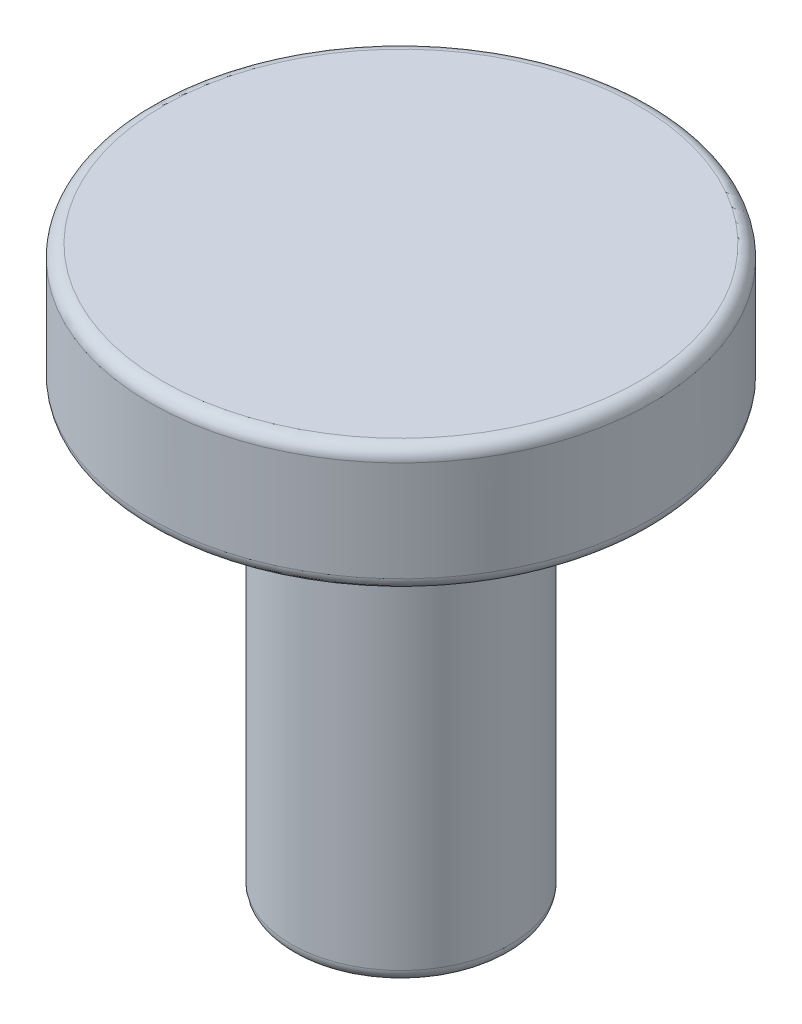
ISO-10303-21;
HEADER;
FILE_DESCRIPTION(('STEP AP214'),'2;1');
FILE_NAME('part.step','',(''),(''),'','','');
FILE_SCHEMA(('AUTOMOTIVE_DESIGN { 1 0 10303 214 1 1 1 1 }'));
ENDSEC;
DATA;
#1=APPLICATION_CONTEXT('core data for automotive mechanical design processes');
#2=APPLICATION_PROTOCOL_DEFINITION('international standard','automotive_design',2000,#1);
#3=PRODUCT_CONTEXT('',#1,'mechanical');
#4=PRODUCT('Part','Part','',(#3));
#5=PRODUCT_RELATED_PRODUCT_CATEGORY('part','',(#4));
#6=PRODUCT_DEFINITION_FORMATION('','',#4);
#7=PRODUCT_DEFINITION_CONTEXT('part definition',#1,'design');
#8=PRODUCT_DEFINITION('design','',#6,#7);
#9=PRODUCT_DEFINITION_SHAPE('','',#8);
#10=(LENGTH_UNIT() NAMED_UNIT(*) SI_UNIT(.MILLI.,.METRE.));
#11=(NAMED_UNIT(*) PLANE_ANGLE_UNIT() SI_UNIT($,.RADIAN.));
#12=(NAMED_UNIT(*) SI_UNIT($,.STERADIAN.) SOLID_ANGLE_UNIT());
#13=UNCERTAINTY_MEASURE_WITH_UNIT(LENGTH_MEASURE(1.E-05),#10,'distance_accuracy_value','');
#14=(GEOMETRIC_REPRESENTATION_CONTEXT(3) GLOBAL_UNCERTAINTY_ASSIGNED_CONTEXT((#13)) GLOBAL_UNIT_ASSIGNED_CONTEXT((#10,
#11,#12)) REPRESENTATION_CONTEXT('',''));
#15=CARTESIAN_POINT('',(0.,0.,0.));
#16=DIRECTION('',(0.,0.,1.));
#17=DIRECTION('',(1.,0.,0.));
#18=AXIS2_PLACEMENT_3D('',#15,#16,#17);
#19=CARTESIAN_POINT('',(0.,0.,1.75));
#20=DIRECTION('',(0.,-1.,0.));
#21=DIRECTION('',(0.,0.,-1.));
#22=AXIS2_PLACEMENT_3D('',#19,#20,#21);
#23=CYLINDRICAL_SURFACE('',#22,1.75);
#24=CARTESIAN_POINT('',(0.,0.2,1.75));
#25=DIRECTION('',(0.,-1.,0.));
#26=DIRECTION('',(0.,0.,-1.));
#27=AXIS2_PLACEMENT_3D('',#24,#25,#26);
#28=CIRCLE('',#27,1.75);
#29=CARTESIAN_POINT('',(0.,0.2,0.));
#30=VERTEX_POINT('',#29);
#31=EDGE_CURVE('E51',#30,#30,#28,.F.);
#32=ORIENTED_EDGE('',*,*,#31,.T.);
#33=EDGE_LOOP('',(#32));
#34=FACE_BOUND('',#33,.T.);
#35=CARTESIAN_POINT('',(0.,7.,1.75));
#36=DIRECTION('',(0.,-1.,0.));
#37=DIRECTION('',(0.,0.,-1.));
#38=AXIS2_PLACEMENT_3D('',#35,#36,#37);
#39=CIRCLE('',#38,1.75);
#40=CARTESIAN_POINT('',(0.,7.,0.));
#41=VERTEX_POINT('',#40);
#42=EDGE_CURVE('E57',#41,#41,#39,.T.);
#43=ORIENTED_EDGE('',*,*,#42,.T.);
#44=EDGE_LOOP('',(#43));
#45=FACE_BOUND('',#44,.T.);
#46=ADVANCED_FACE('F31',(#34,#45),#23,.T.);
#47=CARTESIAN_POINT('',(0.,0.,0.));
#48=DIRECTION('',(0.,-1.,0.));
#49=DIRECTION('',(0.,0.,-1.));
#50=AXIS2_PLACEMENT_3D('',#47,#48,#49);
#51=PLANE('',#50);
#52=CARTESIAN_POINT('',(0.,0.,1.75));
#53=DIRECTION('',(0.,-1.,0.));
#54=DIRECTION('',(0.,0.,-1.));
#55=AXIS2_PLACEMENT_3D('',#52,#53,#54);
#56=CIRCLE('',#55,1.55);
#57=CARTESIAN_POINT('',(0.,0.,0.2));
#58=VERTEX_POINT('',#57);
#59=EDGE_CURVE('E54',#58,#58,#56,.T.);
#60=ORIENTED_EDGE('',*,*,#59,.T.);
#61=EDGE_LOOP('',(#60));
#62=FACE_BOUND('',#61,.T.);
#63=ADVANCED_FACE('F78',(#62),#51,.T.);
#64=CARTESIAN_POINT('',(0.,9.,1.75));
#65=DIRECTION('',(0.,1.,0.));
#66=DIRECTION('',(0.,0.,1.));
#67=AXIS2_PLACEMENT_3D('',#64,#65,#66);
#68=PLANE('',#67);
#69=CARTESIAN_POINT('',(0.,9.,1.75));
#70=DIRECTION('',(0.,1.,0.));
#71=DIRECTION('',(0.,0.,1.));
#72=AXIS2_PLACEMENT_3D('',#69,#70,#71);
#73=CIRCLE('',#72,3.8);
#74=CARTESIAN_POINT('',(0.,9.,5.55));
#75=VERTEX_POINT('',#74);
#76=EDGE_CURVE('E38',#75,#75,#73,.T.);
#77=ORIENTED_EDGE('',*,*,#76,.T.);
#78=EDGE_LOOP('',(#77));
#79=FACE_BOUND('',#78,.T.);
#80=ADVANCED_FACE('F74',(#79),#68,.T.);
#81=CARTESIAN_POINT('',(0.,0.,1.75));
#82=DIRECTION('',(0.,-1.,0.));
#83=DIRECTION('',(0.,0.,-1.));
#84=AXIS2_PLACEMENT_3D('',#81,#82,#83);
#85=CYLINDRICAL_SURFACE('',#84,4.);
#86=CARTESIAN_POINT('',(0.,8.8,1.75));
#87=DIRECTION('',(0.,1.,0.));
#88=DIRECTION('',(0.,0.,1.));
#89=AXIS2_PLACEMENT_3D('',#86,#87,#88);
#90=CIRCLE('',#89,4.);
#91=CARTESIAN_POINT('',(0.,8.8,5.75));
#92=VERTEX_POINT('',#91);
#93=EDGE_CURVE('E42',#92,#92,#90,.F.);
#94=ORIENTED_EDGE('',*,*,#93,.T.);
#95=EDGE_LOOP('',(#94));
#96=FACE_BOUND('',#95,.T.);
#97=CARTESIAN_POINT('',(0.,7.2,1.75));
#98=DIRECTION('',(0.,-1.,0.));
#99=DIRECTION('',(0.,0.,-1.));
#100=AXIS2_PLACEMENT_3D('',#97,#98,#99);
#101=CIRCLE('',#100,4.);
#102=CARTESIAN_POINT('',(0.,7.2,-2.25));
#103=VERTEX_POINT('',#102);
#104=EDGE_CURVE('E46',#103,#103,#101,.F.);
#105=ORIENTED_EDGE('',*,*,#104,.T.);
#106=EDGE_LOOP('',(#105));
#107=FACE_BOUND('',#106,.T.);
#108=ADVANCED_FACE('F65',(#96,#107),#85,.T.);
#109=CARTESIAN_POINT('',(0.,7.,-2.25));
#110=DIRECTION('',(0.,-1.,0.));
#111=DIRECTION('',(0.,0.,-1.));
#112=AXIS2_PLACEMENT_3D('',#109,#110,#111);
#113=PLANE('',#112);
#114=CARTESIAN_POINT('',(0.,7.,1.75));
#115=DIRECTION('',(0.,-1.,0.));
#116=DIRECTION('',(0.,0.,-1.));
#117=AXIS2_PLACEMENT_3D('',#114,#115,#116);
#118=CIRCLE('',#117,3.8);
#119=CARTESIAN_POINT('',(0.,7.,-2.05));
#120=VERTEX_POINT('',#119);
#121=EDGE_CURVE('E10',#120,#120,#118,.T.);
#122=ORIENTED_EDGE('',*,*,#121,.T.);
#123=EDGE_LOOP('',(#122));
#124=FACE_BOUND('',#123,.T.);
#125=ORIENTED_EDGE('',*,*,#42,.F.);
#126=EDGE_LOOP('',(#125));
#127=FACE_BOUND('',#126,.T.);
#128=ADVANCED_FACE('F62',(#124,#127),#113,.T.);
#129=CARTESIAN_POINT('',(0.,0.2,1.75));
#130=DIRECTION('',(0.,-1.,0.));
#131=DIRECTION('',(0.,0.,-1.));
#132=AXIS2_PLACEMENT_3D('',#129,#130,#131);
#133=TOROIDAL_SURFACE('',#132,1.55,0.2);
#134=ORIENTED_EDGE('',*,*,#31,.F.);
#135=EDGE_LOOP('',(#134));
#136=FACE_BOUND('',#135,.T.);
#137=ORIENTED_EDGE('',*,*,#59,.F.);
#138=EDGE_LOOP('',(#137));
#139=FACE_BOUND('',#138,.T.);
#140=ADVANCED_FACE('F64',(#136,#139),#133,.T.);
#141=CARTESIAN_POINT('',(0.,8.8,1.75));
#142=DIRECTION('',(0.,1.,0.));
#143=DIRECTION('',(0.,0.,1.));
#144=AXIS2_PLACEMENT_3D('',#141,#142,#143);
#145=TOROIDAL_SURFACE('',#144,3.8,0.2);
#146=ORIENTED_EDGE('',*,*,#76,.F.);
#147=EDGE_LOOP('',(#146));
#148=FACE_BOUND('',#147,.T.);
#149=ORIENTED_EDGE('',*,*,#93,.F.);
#150=EDGE_LOOP('',(#149));
#151=FACE_BOUND('',#150,.T.);
#152=ADVANCED_FACE('F71',(#148,#151),#145,.T.);
#153=CARTESIAN_POINT('',(0.,7.2,1.75));
#154=DIRECTION('',(0.,-1.,0.));
#155=DIRECTION('',(0.,0.,-1.));
#156=AXIS2_PLACEMENT_3D('',#153,#154,#155);
#157=TOROIDAL_SURFACE('',#156,3.8,0.2);
#158=ORIENTED_EDGE('',*,*,#104,.F.);
#159=EDGE_LOOP('',(#158));
#160=FACE_BOUND('',#159,.T.);
#161=ORIENTED_EDGE('',*,*,#121,.F.);
#162=EDGE_LOOP('',(#161));
#163=FACE_BOUND('',#162,.T.);
#164=ADVANCED_FACE('F33',(#160,#163),#157,.T.);
#165=CLOSED_SHELL('',(#46,#63,#80,#108,#128,#140,#152,#164));
#166=MANIFOLD_SOLID_BREP('B2',#165);
#167=ADVANCED_BREP_SHAPE_REPRESENTATION('',(#18,#166),#14);
#168=SHAPE_DEFINITION_REPRESENTATION(#9,#167);
ENDSEC;
END-ISO-10303-21;
